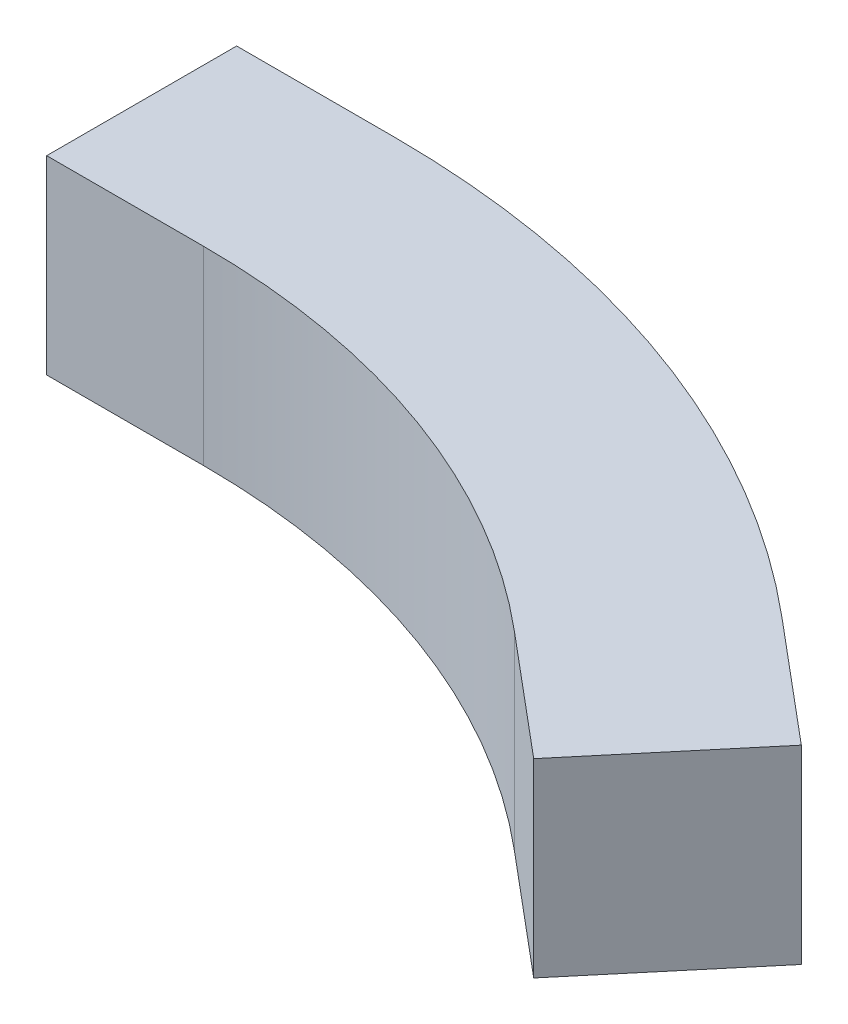
ISO-10303-21;
HEADER;
FILE_DESCRIPTION(('STEP AP214'),'2;1');
FILE_NAME('part.step','',(''),(''),'','','');
FILE_SCHEMA(('AUTOMOTIVE_DESIGN { 1 0 10303 214 1 1 1 1 }'));
ENDSEC;
DATA;
#1=APPLICATION_CONTEXT('core data for automotive mechanical design processes');
#2=APPLICATION_PROTOCOL_DEFINITION('international standard','automotive_design',2000,#1);
#3=PRODUCT_CONTEXT('',#1,'mechanical');
#4=PRODUCT('Part','Part','',(#3));
#5=PRODUCT_RELATED_PRODUCT_CATEGORY('part','',(#4));
#6=PRODUCT_DEFINITION_FORMATION('','',#4);
#7=PRODUCT_DEFINITION_CONTEXT('part definition',#1,'design');
#8=PRODUCT_DEFINITION('design','',#6,#7);
#9=PRODUCT_DEFINITION_SHAPE('','',#8);
#10=(LENGTH_UNIT() NAMED_UNIT(*) SI_UNIT(.MILLI.,.METRE.));
#11=(NAMED_UNIT(*) PLANE_ANGLE_UNIT() SI_UNIT($,.RADIAN.));
#12=(NAMED_UNIT(*) SI_UNIT($,.STERADIAN.) SOLID_ANGLE_UNIT());
#13=UNCERTAINTY_MEASURE_WITH_UNIT(LENGTH_MEASURE(1.E-05),#10,'distance_accuracy_value','');
#14=(GEOMETRIC_REPRESENTATION_CONTEXT(3) GLOBAL_UNCERTAINTY_ASSIGNED_CONTEXT((#13)) GLOBAL_UNIT_ASSIGNED_CONTEXT((#10,
#11,#12)) REPRESENTATION_CONTEXT('',''));
#15=CARTESIAN_POINT('',(0.,0.,0.));
#16=DIRECTION('',(0.,0.,1.));
#17=DIRECTION('',(1.,0.,0.));
#18=AXIS2_PLACEMENT_3D('',#15,#16,#17);
#19=CARTESIAN_POINT('',(0.,15.,0.));
#20=DIRECTION('',(0.,-1.,0.));
#21=DIRECTION('',(0.,0.,-1.));
#22=AXIS2_PLACEMENT_3D('',#19,#20,#21);
#23=CYLINDRICAL_SURFACE('',#22,60.);
#24=CARTESIAN_POINT('',(0.,0.,0.));
#25=DIRECTION('',(0.,1.,0.));
#26=DIRECTION('',(0.,0.,1.));
#27=AXIS2_PLACEMENT_3D('',#24,#25,#26);
#28=CIRCLE('',#27,60.);
#29=CARTESIAN_POINT('',(38.5672565811924,0.,-45.9626665871386));
#30=VERTEX_POINT('',#29);
#31=CARTESIAN_POINT('',(0.,0.,-60.));
#32=VERTEX_POINT('',#31);
#33=EDGE_CURVE('E142',#30,#32,#28,.T.);
#34=ORIENTED_EDGE('',*,*,#33,.F.);
#35=DIRECTION('',(0.,-1.,0.));
#36=VECTOR('',#35,1.);
#37=CARTESIAN_POINT('',(38.5672565811924,15.,-45.9626665871386));
#38=LINE('',#37,#36);
#39=CARTESIAN_POINT('',(38.5672565811924,15.,-45.9626665871386));
#40=VERTEX_POINT('',#39);
#41=EDGE_CURVE('E11',#40,#30,#38,.T.);
#42=ORIENTED_EDGE('',*,*,#41,.F.);
#43=CARTESIAN_POINT('',(0.,15.,0.));
#44=DIRECTION('',(0.,1.,0.));
#45=DIRECTION('',(0.,0.,1.));
#46=AXIS2_PLACEMENT_3D('',#43,#44,#45);
#47=CIRCLE('',#46,60.);
#48=CARTESIAN_POINT('',(0.,15.,-60.));
#49=VERTEX_POINT('',#48);
#50=EDGE_CURVE('E169',#40,#49,#47,.T.);
#51=ORIENTED_EDGE('',*,*,#50,.T.);
#52=DIRECTION('',(0.,-1.,0.));
#53=VECTOR('',#52,1.);
#54=CARTESIAN_POINT('',(0.,15.,-60.));
#55=LINE('',#54,#53);
#56=EDGE_CURVE('E60',#49,#32,#55,.T.);
#57=ORIENTED_EDGE('',*,*,#56,.T.);
#58=EDGE_LOOP('',(#34,#42,#51,#57));
#59=FACE_BOUND('',#58,.T.);
#60=ADVANCED_FACE('F43',(#59),#23,.F.);
#61=CARTESIAN_POINT('',(38.5672565811924,15.,-45.9626665871386));
#62=DIRECTION('',(-0.64278760968654,0.,0.766044443118977));
#63=DIRECTION('',(0.766044443118977,0.,0.64278760968654));
#64=AXIS2_PLACEMENT_3D('',#61,#62,#63);
#65=PLANE('',#64);
#66=DIRECTION('',(-0.766044443118977,0.,-0.64278760968654));
#67=VECTOR('',#66,1.);
#68=CARTESIAN_POINT('',(38.5672565811924,0.,-45.9626665871386));
#69=LINE('',#68,#67);
#70=CARTESIAN_POINT('',(48.0662076758678,0.,-37.9921002270255));
#71=VERTEX_POINT('',#70);
#72=EDGE_CURVE('E145',#71,#30,#69,.T.);
#73=ORIENTED_EDGE('',*,*,#72,.F.);
#74=DIRECTION('',(0.,-1.,0.));
#75=VECTOR('',#74,1.);
#76=CARTESIAN_POINT('',(48.0662076758678,15.,-37.9921002270255));
#77=LINE('',#76,#75);
#78=CARTESIAN_POINT('',(48.0662076758678,15.,-37.9921002270255));
#79=VERTEX_POINT('',#78);
#80=EDGE_CURVE('E52',#79,#71,#77,.T.);
#81=ORIENTED_EDGE('',*,*,#80,.F.);
#82=DIRECTION('',(-0.766044443118977,0.,-0.64278760968654));
#83=VECTOR('',#82,1.);
#84=CARTESIAN_POINT('',(38.5672565811924,15.,-45.9626665871386));
#85=LINE('',#84,#83);
#86=EDGE_CURVE('E201',#79,#40,#85,.T.);
#87=ORIENTED_EDGE('',*,*,#86,.T.);
#88=ORIENTED_EDGE('',*,*,#41,.T.);
#89=EDGE_LOOP('',(#73,#81,#87,#88));
#90=FACE_BOUND('',#89,.T.);
#91=ADVANCED_FACE('F192',(#90),#65,.T.);
#92=CARTESIAN_POINT('',(9.49895109467531,15.,7.9705663601131));
#93=DIRECTION('',(0.766044443118977,0.,0.642787609686541));
#94=DIRECTION('',(0.642787609686541,0.,-0.766044443118977));
#95=AXIS2_PLACEMENT_3D('',#92,#93,#94);
#96=PLANE('',#95);
#97=DIRECTION('',(-0.642787609686541,0.,0.766044443118977));
#98=VECTOR('',#97,1.);
#99=CARTESIAN_POINT('',(9.49895109467531,0.,7.9705663601131));
#100=LINE('',#99,#98);
#101=CARTESIAN_POINT('',(57.7080218211658,0.,-49.4827668738102));
#102=VERTEX_POINT('',#101);
#103=EDGE_CURVE('E149',#102,#71,#100,.T.);
#104=ORIENTED_EDGE('',*,*,#103,.F.);
#105=DIRECTION('',(0.,-1.,0.));
#106=VECTOR('',#105,1.);
#107=CARTESIAN_POINT('',(57.7080218211658,15.,-49.4827668738102));
#108=LINE('',#107,#106);
#109=CARTESIAN_POINT('',(57.7080218211658,15.,-49.4827668738102));
#110=VERTEX_POINT('',#109);
#111=EDGE_CURVE('E179',#110,#102,#108,.T.);
#112=ORIENTED_EDGE('',*,*,#111,.F.);
#113=DIRECTION('',(-0.642787609686541,0.,0.766044443118977));
#114=VECTOR('',#113,1.);
#115=CARTESIAN_POINT('',(9.49895109467531,15.,7.9705663601131));
#116=LINE('',#115,#114);
#117=EDGE_CURVE('E188',#110,#79,#116,.T.);
#118=ORIENTED_EDGE('',*,*,#117,.T.);
#119=ORIENTED_EDGE('',*,*,#80,.T.);
#120=EDGE_LOOP('',(#104,#112,#118,#119));
#121=FACE_BOUND('',#120,.T.);
#122=ADVANCED_FACE('F186',(#121),#96,.T.);
#123=CARTESIAN_POINT('',(48.2090707264905,15.,-57.4533332339233));
#124=DIRECTION('',(0.64278760968654,0.,-0.766044443118977));
#125=DIRECTION('',(-0.766044443118977,0.,-0.64278760968654));
#126=AXIS2_PLACEMENT_3D('',#123,#124,#125);
#127=PLANE('',#126);
#128=DIRECTION('',(0.766044443118977,0.,0.64278760968654));
#129=VECTOR('',#128,1.);
#130=CARTESIAN_POINT('',(48.2090707264905,0.,-57.4533332339233));
#131=LINE('',#130,#129);
#132=CARTESIAN_POINT('',(48.2090707264905,0.,-57.4533332339233));
#133=VERTEX_POINT('',#132);
#134=EDGE_CURVE('E153',#133,#102,#131,.T.);
#135=ORIENTED_EDGE('',*,*,#134,.F.);
#136=DIRECTION('',(0.,-1.,0.));
#137=VECTOR('',#136,1.);
#138=CARTESIAN_POINT('',(48.2090707264905,15.,-57.4533332339233));
#139=LINE('',#138,#137);
#140=CARTESIAN_POINT('',(48.2090707264905,15.,-57.4533332339233));
#141=VERTEX_POINT('',#140);
#142=EDGE_CURVE('E176',#141,#133,#139,.T.);
#143=ORIENTED_EDGE('',*,*,#142,.F.);
#144=DIRECTION('',(0.766044443118977,0.,0.64278760968654));
#145=VECTOR('',#144,1.);
#146=CARTESIAN_POINT('',(48.2090707264905,15.,-57.4533332339233));
#147=LINE('',#146,#145);
#148=EDGE_CURVE('E200',#141,#110,#147,.T.);
#149=ORIENTED_EDGE('',*,*,#148,.T.);
#150=ORIENTED_EDGE('',*,*,#111,.T.);
#151=EDGE_LOOP('',(#135,#143,#149,#150));
#152=FACE_BOUND('',#151,.T.);
#153=ADVANCED_FACE('F198',(#152),#127,.T.);
#154=CARTESIAN_POINT('',(0.,15.,0.));
#155=DIRECTION('',(0.,-1.,0.));
#156=DIRECTION('',(0.,0.,-1.));
#157=AXIS2_PLACEMENT_3D('',#154,#155,#156);
#158=CYLINDRICAL_SURFACE('',#157,75.);
#159=CARTESIAN_POINT('',(0.,0.,0.));
#160=DIRECTION('',(0.,1.,0.));
#161=DIRECTION('',(0.,0.,1.));
#162=AXIS2_PLACEMENT_3D('',#159,#160,#161);
#163=CIRCLE('',#162,75.);
#164=CARTESIAN_POINT('',(0.,0.,-75.));
#165=VERTEX_POINT('',#164);
#166=EDGE_CURVE('E157',#133,#165,#163,.T.);
#167=ORIENTED_EDGE('',*,*,#166,.T.);
#168=DIRECTION('',(0.,-1.,0.));
#169=VECTOR('',#168,1.);
#170=CARTESIAN_POINT('',(0.,15.,-75.));
#171=LINE('',#170,#169);
#172=CARTESIAN_POINT('',(0.,15.,-75.));
#173=VERTEX_POINT('',#172);
#174=EDGE_CURVE('E132',#173,#165,#171,.T.);
#175=ORIENTED_EDGE('',*,*,#174,.F.);
#176=CARTESIAN_POINT('',(0.,15.,0.));
#177=DIRECTION('',(0.,1.,0.));
#178=DIRECTION('',(0.,0.,1.));
#179=AXIS2_PLACEMENT_3D('',#176,#177,#178);
#180=CIRCLE('',#179,75.);
#181=EDGE_CURVE('E118',#141,#173,#180,.T.);
#182=ORIENTED_EDGE('',*,*,#181,.F.);
#183=ORIENTED_EDGE('',*,*,#142,.T.);
#184=EDGE_LOOP('',(#167,#175,#182,#183));
#185=FACE_BOUND('',#184,.T.);
#186=ADVANCED_FACE('F232',(#185),#158,.T.);
#187=CARTESIAN_POINT('',(0.,15.,-75.));
#188=DIRECTION('',(0.,0.,1.));
#189=DIRECTION('',(1.,0.,0.));
#190=AXIS2_PLACEMENT_3D('',#187,#188,#189);
#191=PLANE('',#190);
#192=DIRECTION('',(-1.,0.,0.));
#193=VECTOR('',#192,1.);
#194=CARTESIAN_POINT('',(0.,0.,-75.));
#195=LINE('',#194,#193);
#196=CARTESIAN_POINT('',(-12.4,0.,-75.));
#197=VERTEX_POINT('',#196);
#198=EDGE_CURVE('E128',#165,#197,#195,.T.);
#199=ORIENTED_EDGE('',*,*,#198,.T.);
#200=DIRECTION('',(0.,-1.,0.));
#201=VECTOR('',#200,1.);
#202=CARTESIAN_POINT('',(-12.4,15.,-75.));
#203=LINE('',#202,#201);
#204=CARTESIAN_POINT('',(-12.4,15.,-75.));
#205=VERTEX_POINT('',#204);
#206=EDGE_CURVE('E125',#205,#197,#203,.T.);
#207=ORIENTED_EDGE('',*,*,#206,.F.);
#208=DIRECTION('',(-1.,0.,0.));
#209=VECTOR('',#208,1.);
#210=CARTESIAN_POINT('',(0.,15.,-75.));
#211=LINE('',#210,#209);
#212=EDGE_CURVE('E110',#173,#205,#211,.T.);
#213=ORIENTED_EDGE('',*,*,#212,.F.);
#214=ORIENTED_EDGE('',*,*,#174,.T.);
#215=EDGE_LOOP('',(#199,#207,#213,#214));
#216=FACE_BOUND('',#215,.T.);
#217=ADVANCED_FACE('F126',(#216),#191,.F.);
#218=CARTESIAN_POINT('',(-12.4,15.,0.));
#219=DIRECTION('',(1.,0.,0.));
#220=DIRECTION('',(0.,0.,-1.));
#221=AXIS2_PLACEMENT_3D('',#218,#219,#220);
#222=PLANE('',#221);
#223=DIRECTION('',(0.,0.,1.));
#224=VECTOR('',#223,1.);
#225=CARTESIAN_POINT('',(-12.4,0.,0.));
#226=LINE('',#225,#224);
#227=CARTESIAN_POINT('',(-12.4,0.,-60.));
#228=VERTEX_POINT('',#227);
#229=EDGE_CURVE('E162',#197,#228,#226,.T.);
#230=ORIENTED_EDGE('',*,*,#229,.T.);
#231=DIRECTION('',(0.,-1.,0.));
#232=VECTOR('',#231,1.);
#233=CARTESIAN_POINT('',(-12.4,15.,-60.));
#234=LINE('',#233,#232);
#235=CARTESIAN_POINT('',(-12.4,15.,-60.));
#236=VERTEX_POINT('',#235);
#237=EDGE_CURVE('E86',#236,#228,#234,.T.);
#238=ORIENTED_EDGE('',*,*,#237,.F.);
#239=DIRECTION('',(0.,0.,1.));
#240=VECTOR('',#239,1.);
#241=CARTESIAN_POINT('',(-12.4,15.,0.));
#242=LINE('',#241,#240);
#243=EDGE_CURVE('E115',#205,#236,#242,.T.);
#244=ORIENTED_EDGE('',*,*,#243,.F.);
#245=ORIENTED_EDGE('',*,*,#206,.T.);
#246=EDGE_LOOP('',(#230,#238,#244,#245));
#247=FACE_BOUND('',#246,.T.);
#248=ADVANCED_FACE('F134',(#247),#222,.F.);
#249=CARTESIAN_POINT('',(0.,15.,-60.));
#250=DIRECTION('',(0.,0.,1.));
#251=DIRECTION('',(1.,0.,0.));
#252=AXIS2_PLACEMENT_3D('',#249,#250,#251);
#253=PLANE('',#252);
#254=DIRECTION('',(-1.,0.,0.));
#255=VECTOR('',#254,1.);
#256=CARTESIAN_POINT('',(0.,0.,-60.));
#257=LINE('',#256,#255);
#258=EDGE_CURVE('E165',#32,#228,#257,.T.);
#259=ORIENTED_EDGE('',*,*,#258,.F.);
#260=ORIENTED_EDGE('',*,*,#56,.F.);
#261=DIRECTION('',(-1.,0.,0.));
#262=VECTOR('',#261,1.);
#263=CARTESIAN_POINT('',(0.,15.,-60.));
#264=LINE('',#263,#262);
#265=EDGE_CURVE('E136',#49,#236,#264,.T.);
#266=ORIENTED_EDGE('',*,*,#265,.T.);
#267=ORIENTED_EDGE('',*,*,#237,.T.);
#268=EDGE_LOOP('',(#259,#260,#266,#267));
#269=FACE_BOUND('',#268,.T.);
#270=ADVANCED_FACE('F211',(#269),#253,.T.);
#271=CARTESIAN_POINT('',(0.,15.,0.));
#272=DIRECTION('',(0.,1.,0.));
#273=DIRECTION('',(0.,0.,1.));
#274=AXIS2_PLACEMENT_3D('',#271,#272,#273);
#275=PLANE('',#274);
#276=ORIENTED_EDGE('',*,*,#50,.F.);
#277=ORIENTED_EDGE('',*,*,#86,.F.);
#278=ORIENTED_EDGE('',*,*,#117,.F.);
#279=ORIENTED_EDGE('',*,*,#148,.F.);
#280=ORIENTED_EDGE('',*,*,#181,.T.);
#281=ORIENTED_EDGE('',*,*,#212,.T.);
#282=ORIENTED_EDGE('',*,*,#243,.T.);
#283=ORIENTED_EDGE('',*,*,#265,.F.);
#284=EDGE_LOOP('',(#276,#277,#278,#279,#280,#281,#282,#283));
#285=FACE_BOUND('',#284,.T.);
#286=ADVANCED_FACE('F112',(#285),#275,.T.);
#287=CARTESIAN_POINT('',(0.,0.,0.));
#288=DIRECTION('',(0.,1.,0.));
#289=DIRECTION('',(0.,0.,1.));
#290=AXIS2_PLACEMENT_3D('',#287,#288,#289);
#291=PLANE('',#290);
#292=ORIENTED_EDGE('',*,*,#33,.T.);
#293=ORIENTED_EDGE('',*,*,#258,.T.);
#294=ORIENTED_EDGE('',*,*,#229,.F.);
#295=ORIENTED_EDGE('',*,*,#198,.F.);
#296=ORIENTED_EDGE('',*,*,#166,.F.);
#297=ORIENTED_EDGE('',*,*,#134,.T.);
#298=ORIENTED_EDGE('',*,*,#103,.T.);
#299=ORIENTED_EDGE('',*,*,#72,.T.);
#300=EDGE_LOOP('',(#292,#293,#294,#295,#296,#297,#298,#299));
#301=FACE_BOUND('',#300,.T.);
#302=ADVANCED_FACE('F194',(#301),#291,.F.);
#303=CLOSED_SHELL('',(#60,#91,#122,#153,#186,#217,#248,#270,#286,#302));
#304=MANIFOLD_SOLID_BREP('B2',#303);
#305=ADVANCED_BREP_SHAPE_REPRESENTATION('',(#18,#304),#14);
#306=SHAPE_DEFINITION_REPRESENTATION(#9,#305);
ENDSEC;
END-ISO-10303-21;
